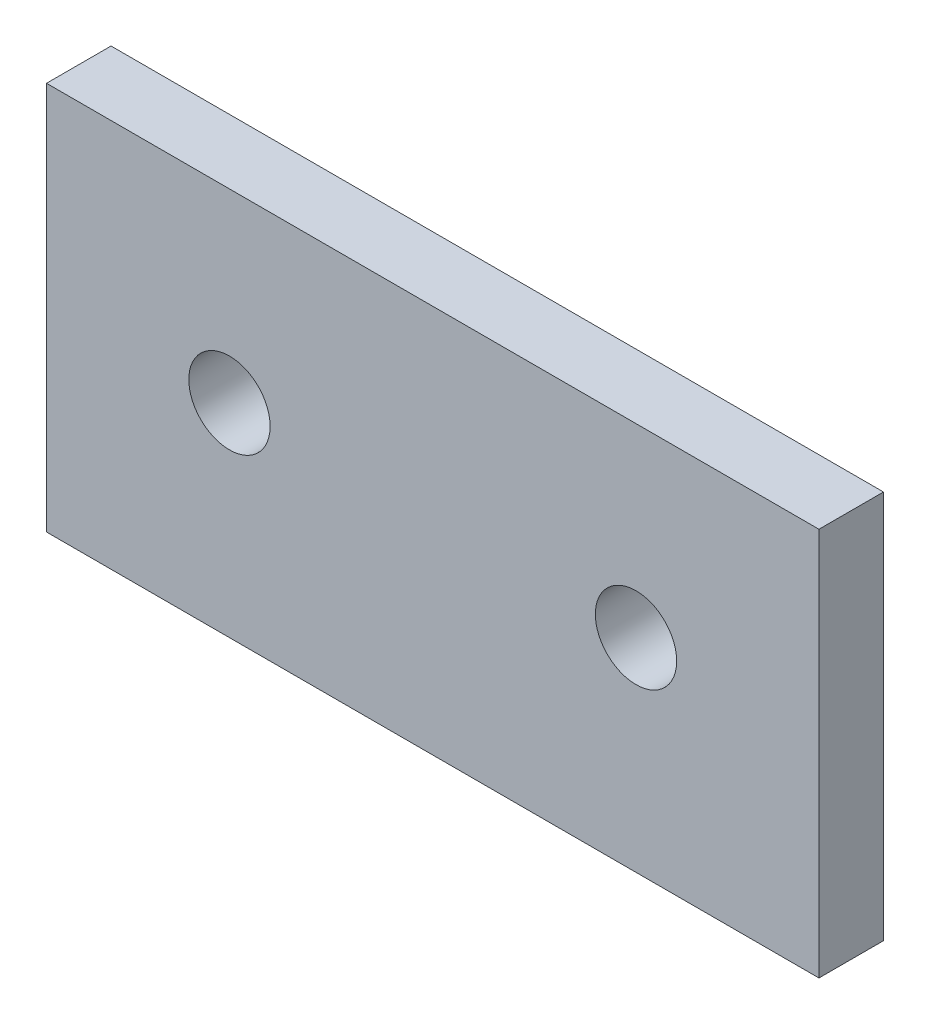
ISO-10303-21;
HEADER;
FILE_DESCRIPTION(('STEP AP214'),'2;1');
FILE_NAME('part.step','',(''),(''),'','','');
FILE_SCHEMA(('AUTOMOTIVE_DESIGN { 1 0 10303 214 1 1 1 1 }'));
ENDSEC;
DATA;
#1=APPLICATION_CONTEXT('core data for automotive mechanical design processes');
#2=APPLICATION_PROTOCOL_DEFINITION('international standard','automotive_design',2000,#1);
#3=PRODUCT_CONTEXT('',#1,'mechanical');
#4=PRODUCT('Part','Part','',(#3));
#5=PRODUCT_RELATED_PRODUCT_CATEGORY('part','',(#4));
#6=PRODUCT_DEFINITION_FORMATION('','',#4);
#7=PRODUCT_DEFINITION_CONTEXT('part definition',#1,'design');
#8=PRODUCT_DEFINITION('design','',#6,#7);
#9=PRODUCT_DEFINITION_SHAPE('','',#8);
#10=(LENGTH_UNIT() NAMED_UNIT(*) SI_UNIT(.MILLI.,.METRE.));
#11=(NAMED_UNIT(*) PLANE_ANGLE_UNIT() SI_UNIT($,.RADIAN.));
#12=(NAMED_UNIT(*) SI_UNIT($,.STERADIAN.) SOLID_ANGLE_UNIT());
#13=UNCERTAINTY_MEASURE_WITH_UNIT(LENGTH_MEASURE(1.E-05),#10,'distance_accuracy_value','');
#14=(GEOMETRIC_REPRESENTATION_CONTEXT(3) GLOBAL_UNCERTAINTY_ASSIGNED_CONTEXT((#13)) GLOBAL_UNIT_ASSIGNED_CONTEXT((#10,
#11,#12)) REPRESENTATION_CONTEXT('',''));
#15=CARTESIAN_POINT('',(0.,0.,0.));
#16=DIRECTION('',(0.,0.,1.));
#17=DIRECTION('',(1.,0.,0.));
#18=AXIS2_PLACEMENT_3D('',#15,#16,#17);
#19=CARTESIAN_POINT('',(0.,0.,6.34999999999999));
#20=DIRECTION('',(0.,0.,1.));
#21=DIRECTION('',(1.,0.,0.));
#22=AXIS2_PLACEMENT_3D('',#19,#20,#21);
#23=PLANE('',#22);
#24=CARTESIAN_POINT('',(17.9999999999996,24.3085630953438,6.34999999999999));
#25=DIRECTION('',(0.,0.,1.));
#26=DIRECTION('',(1.,0.,0.));
#27=AXIS2_PLACEMENT_3D('',#24,#25,#26);
#28=CIRCLE('',#27,3.99999999999999);
#29=CARTESIAN_POINT('',(21.9999999999996,24.3085630953438,6.34999999999999));
#30=VERTEX_POINT('',#29);
#31=EDGE_CURVE('E121',#30,#30,#28,.T.);
#32=ORIENTED_EDGE('',*,*,#31,.F.);
#33=EDGE_LOOP('',(#32));
#34=FACE_BOUND('',#33,.T.);
#35=CARTESIAN_POINT('',(57.9999999999997,24.3085630953441,6.34999999999999));
#36=DIRECTION('',(0.,0.,1.));
#37=DIRECTION('',(1.,0.,0.));
#38=AXIS2_PLACEMENT_3D('',#35,#36,#37);
#39=CIRCLE('',#38,3.99999999999999);
#40=CARTESIAN_POINT('',(61.9999999999996,24.3085630953441,6.34999999999999));
#41=VERTEX_POINT('',#40);
#42=EDGE_CURVE('E115',#41,#41,#39,.T.);
#43=ORIENTED_EDGE('',*,*,#42,.F.);
#44=EDGE_LOOP('',(#43));
#45=FACE_BOUND('',#44,.T.);
#46=DIRECTION('',(0.,-1.,0.));
#47=VECTOR('',#46,1.);
#48=CARTESIAN_POINT('',(-3.88578058618805E-13,42.5467284230885,6.34999999999999));
#49=LINE('',#48,#47);
#50=CARTESIAN_POINT('',(-3.88578058618805E-13,42.5467284230885,6.34999999999999));
#51=VERTEX_POINT('',#50);
#52=CARTESIAN_POINT('',(0.,4.30856309534396,6.34999999999999));
#53=VERTEX_POINT('',#52);
#54=EDGE_CURVE('E87',#51,#53,#49,.T.);
#55=ORIENTED_EDGE('',*,*,#54,.T.);
#56=DIRECTION('',(1.,0.,0.));
#57=VECTOR('',#56,1.);
#58=CARTESIAN_POINT('',(0.,4.30856309534396,6.34999999999999));
#59=LINE('',#58,#57);
#60=CARTESIAN_POINT('',(75.9999999999997,4.30856309534396,6.34999999999999));
#61=VERTEX_POINT('',#60);
#62=EDGE_CURVE('E83',#53,#61,#59,.T.);
#63=ORIENTED_EDGE('',*,*,#62,.T.);
#64=DIRECTION('',(0.,1.,0.));
#65=VECTOR('',#64,1.);
#66=CARTESIAN_POINT('',(75.9999999999997,42.5467284230885,6.34999999999999));
#67=LINE('',#66,#65);
#68=CARTESIAN_POINT('',(75.9999999999997,42.5467284230885,6.34999999999999));
#69=VERTEX_POINT('',#68);
#70=EDGE_CURVE('E85',#61,#69,#67,.T.);
#71=ORIENTED_EDGE('',*,*,#70,.T.);
#72=DIRECTION('',(-1.,0.,0.));
#73=VECTOR('',#72,1.);
#74=CARTESIAN_POINT('',(-3.88578058618805E-13,42.5467284230885,6.34999999999999));
#75=LINE('',#74,#73);
#76=EDGE_CURVE('E53',#69,#51,#75,.T.);
#77=ORIENTED_EDGE('',*,*,#76,.T.);
#78=EDGE_LOOP('',(#55,#63,#71,#77));
#79=FACE_BOUND('',#78,.T.);
#80=ADVANCED_FACE('F36',(#34,#45,#79),#23,.T.);
#81=CARTESIAN_POINT('',(0.,0.,0.));
#82=DIRECTION('',(0.,0.,1.));
#83=DIRECTION('',(1.,0.,0.));
#84=AXIS2_PLACEMENT_3D('',#81,#82,#83);
#85=PLANE('',#84);
#86=CARTESIAN_POINT('',(17.9999999999996,24.3085630953438,0.));
#87=DIRECTION('',(0.,0.,1.));
#88=DIRECTION('',(1.,0.,0.));
#89=AXIS2_PLACEMENT_3D('',#86,#87,#88);
#90=CIRCLE('',#89,4.);
#91=CARTESIAN_POINT('',(21.9999999999996,24.3085630953438,0.));
#92=VERTEX_POINT('',#91);
#93=EDGE_CURVE('E118',#92,#92,#90,.T.);
#94=ORIENTED_EDGE('',*,*,#93,.T.);
#95=EDGE_LOOP('',(#94));
#96=FACE_BOUND('',#95,.T.);
#97=CARTESIAN_POINT('',(57.9999999999997,24.3085630953441,0.));
#98=DIRECTION('',(0.,0.,1.));
#99=DIRECTION('',(1.,0.,0.));
#100=AXIS2_PLACEMENT_3D('',#97,#98,#99);
#101=CIRCLE('',#100,4.);
#102=CARTESIAN_POINT('',(61.9999999999997,24.3085630953441,0.));
#103=VERTEX_POINT('',#102);
#104=EDGE_CURVE('E102',#103,#103,#101,.T.);
#105=ORIENTED_EDGE('',*,*,#104,.T.);
#106=EDGE_LOOP('',(#105));
#107=FACE_BOUND('',#106,.T.);
#108=DIRECTION('',(0.,-1.,0.));
#109=VECTOR('',#108,1.);
#110=CARTESIAN_POINT('',(-3.88578058618805E-13,42.5467284230885,0.));
#111=LINE('',#110,#109);
#112=CARTESIAN_POINT('',(-3.88578058618805E-13,42.5467284230885,0.));
#113=VERTEX_POINT('',#112);
#114=CARTESIAN_POINT('',(0.,4.30856309534396,0.));
#115=VERTEX_POINT('',#114);
#116=EDGE_CURVE('E99',#113,#115,#111,.T.);
#117=ORIENTED_EDGE('',*,*,#116,.F.);
#118=DIRECTION('',(-1.,0.,0.));
#119=VECTOR('',#118,1.);
#120=CARTESIAN_POINT('',(-3.88578058618805E-13,42.5467284230885,0.));
#121=LINE('',#120,#119);
#122=CARTESIAN_POINT('',(75.9999999999997,42.5467284230885,0.));
#123=VERTEX_POINT('',#122);
#124=EDGE_CURVE('E76',#123,#113,#121,.T.);
#125=ORIENTED_EDGE('',*,*,#124,.F.);
#126=DIRECTION('',(0.,1.,0.));
#127=VECTOR('',#126,1.);
#128=CARTESIAN_POINT('',(75.9999999999997,42.5467284230885,0.));
#129=LINE('',#128,#127);
#130=CARTESIAN_POINT('',(75.9999999999997,4.30856309534396,0.));
#131=VERTEX_POINT('',#130);
#132=EDGE_CURVE('E70',#131,#123,#129,.T.);
#133=ORIENTED_EDGE('',*,*,#132,.F.);
#134=DIRECTION('',(1.,0.,0.));
#135=VECTOR('',#134,1.);
#136=CARTESIAN_POINT('',(0.,4.30856309534396,0.));
#137=LINE('',#136,#135);
#138=EDGE_CURVE('E91',#115,#131,#137,.T.);
#139=ORIENTED_EDGE('',*,*,#138,.F.);
#140=EDGE_LOOP('',(#117,#125,#133,#139));
#141=FACE_BOUND('',#140,.T.);
#142=ADVANCED_FACE('F110',(#96,#107,#141),#85,.F.);
#143=CARTESIAN_POINT('',(-3.88578058618805E-13,42.5467284230885,6.34999999999999));
#144=DIRECTION('',(1.,0.,0.));
#145=DIRECTION('',(0.,1.,0.));
#146=AXIS2_PLACEMENT_3D('',#143,#144,#145);
#147=PLANE('',#146);
#148=ORIENTED_EDGE('',*,*,#116,.T.);
#149=DIRECTION('',(0.,0.,-1.));
#150=VECTOR('',#149,1.);
#151=CARTESIAN_POINT('',(0.,4.30856309534396,6.34999999999999));
#152=LINE('',#151,#150);
#153=EDGE_CURVE('E11',#53,#115,#152,.T.);
#154=ORIENTED_EDGE('',*,*,#153,.F.);
#155=ORIENTED_EDGE('',*,*,#54,.F.);
#156=DIRECTION('',(0.,0.,-1.));
#157=VECTOR('',#156,1.);
#158=CARTESIAN_POINT('',(-3.88578058618805E-13,42.5467284230885,6.34999999999999));
#159=LINE('',#158,#157);
#160=EDGE_CURVE('E95',#51,#113,#159,.T.);
#161=ORIENTED_EDGE('',*,*,#160,.T.);
#162=EDGE_LOOP('',(#148,#154,#155,#161));
#163=FACE_BOUND('',#162,.T.);
#164=ADVANCED_FACE('F38',(#163),#147,.F.);
#165=CARTESIAN_POINT('',(0.,4.30856309534396,6.34999999999999));
#166=DIRECTION('',(0.,1.,0.));
#167=DIRECTION('',(0.,0.,1.));
#168=AXIS2_PLACEMENT_3D('',#165,#166,#167);
#169=PLANE('',#168);
#170=ORIENTED_EDGE('',*,*,#138,.T.);
#171=DIRECTION('',(0.,0.,-1.));
#172=VECTOR('',#171,1.);
#173=CARTESIAN_POINT('',(75.9999999999997,4.30856309534396,6.34999999999999));
#174=LINE('',#173,#172);
#175=EDGE_CURVE('E45',#61,#131,#174,.T.);
#176=ORIENTED_EDGE('',*,*,#175,.F.);
#177=ORIENTED_EDGE('',*,*,#62,.F.);
#178=ORIENTED_EDGE('',*,*,#153,.T.);
#179=EDGE_LOOP('',(#170,#176,#177,#178));
#180=FACE_BOUND('',#179,.T.);
#181=ADVANCED_FACE('F90',(#180),#169,.F.);
#182=CARTESIAN_POINT('',(75.9999999999997,42.5467284230885,6.34999999999999));
#183=DIRECTION('',(-1.,0.,0.));
#184=DIRECTION('',(0.,0.,1.));
#185=AXIS2_PLACEMENT_3D('',#182,#183,#184);
#186=PLANE('',#185);
#187=ORIENTED_EDGE('',*,*,#132,.T.);
#188=DIRECTION('',(0.,0.,-1.));
#189=VECTOR('',#188,1.);
#190=CARTESIAN_POINT('',(75.9999999999997,42.5467284230885,6.34999999999999));
#191=LINE('',#190,#189);
#192=EDGE_CURVE('E92',#69,#123,#191,.T.);
#193=ORIENTED_EDGE('',*,*,#192,.F.);
#194=ORIENTED_EDGE('',*,*,#70,.F.);
#195=ORIENTED_EDGE('',*,*,#175,.T.);
#196=EDGE_LOOP('',(#187,#193,#194,#195));
#197=FACE_BOUND('',#196,.T.);
#198=ADVANCED_FACE('F93',(#197),#186,.F.);
#199=CARTESIAN_POINT('',(-3.88578058618805E-13,42.5467284230885,6.34999999999999));
#200=DIRECTION('',(0.,-1.,0.));
#201=DIRECTION('',(0.,0.,-1.));
#202=AXIS2_PLACEMENT_3D('',#199,#200,#201);
#203=PLANE('',#202);
#204=ORIENTED_EDGE('',*,*,#124,.T.);
#205=ORIENTED_EDGE('',*,*,#160,.F.);
#206=ORIENTED_EDGE('',*,*,#76,.F.);
#207=ORIENTED_EDGE('',*,*,#192,.T.);
#208=EDGE_LOOP('',(#204,#205,#206,#207));
#209=FACE_BOUND('',#208,.T.);
#210=ADVANCED_FACE('F107',(#209),#203,.F.);
#211=CARTESIAN_POINT('',(57.9999999999997,24.3085630953441,6.34999999999999));
#212=DIRECTION('',(0.,0.,1.));
#213=DIRECTION('',(1.,0.,0.));
#214=AXIS2_PLACEMENT_3D('',#211,#212,#213);
#215=CYLINDRICAL_SURFACE('',#214,4.);
#216=ORIENTED_EDGE('',*,*,#104,.F.);
#217=EDGE_LOOP('',(#216));
#218=FACE_BOUND('',#217,.T.);
#219=ORIENTED_EDGE('',*,*,#42,.T.);
#220=EDGE_LOOP('',(#219));
#221=FACE_BOUND('',#220,.T.);
#222=ADVANCED_FACE('F132',(#218,#221),#215,.F.);
#223=CARTESIAN_POINT('',(17.9999999999996,24.3085630953438,6.34999999999999));
#224=DIRECTION('',(0.,0.,1.));
#225=DIRECTION('',(1.,0.,0.));
#226=AXIS2_PLACEMENT_3D('',#223,#224,#225);
#227=CYLINDRICAL_SURFACE('',#226,3.99999999999999);
#228=ORIENTED_EDGE('',*,*,#93,.F.);
#229=EDGE_LOOP('',(#228));
#230=FACE_BOUND('',#229,.T.);
#231=ORIENTED_EDGE('',*,*,#31,.T.);
#232=EDGE_LOOP('',(#231));
#233=FACE_BOUND('',#232,.T.);
#234=ADVANCED_FACE('F125',(#230,#233),#227,.F.);
#235=CLOSED_SHELL('',(#80,#142,#164,#181,#198,#210,#222,#234));
#236=MANIFOLD_SOLID_BREP('B2',#235);
#237=ADVANCED_BREP_SHAPE_REPRESENTATION('',(#18,#236),#14);
#238=SHAPE_DEFINITION_REPRESENTATION(#9,#237);
ENDSEC;
END-ISO-10303-21;
